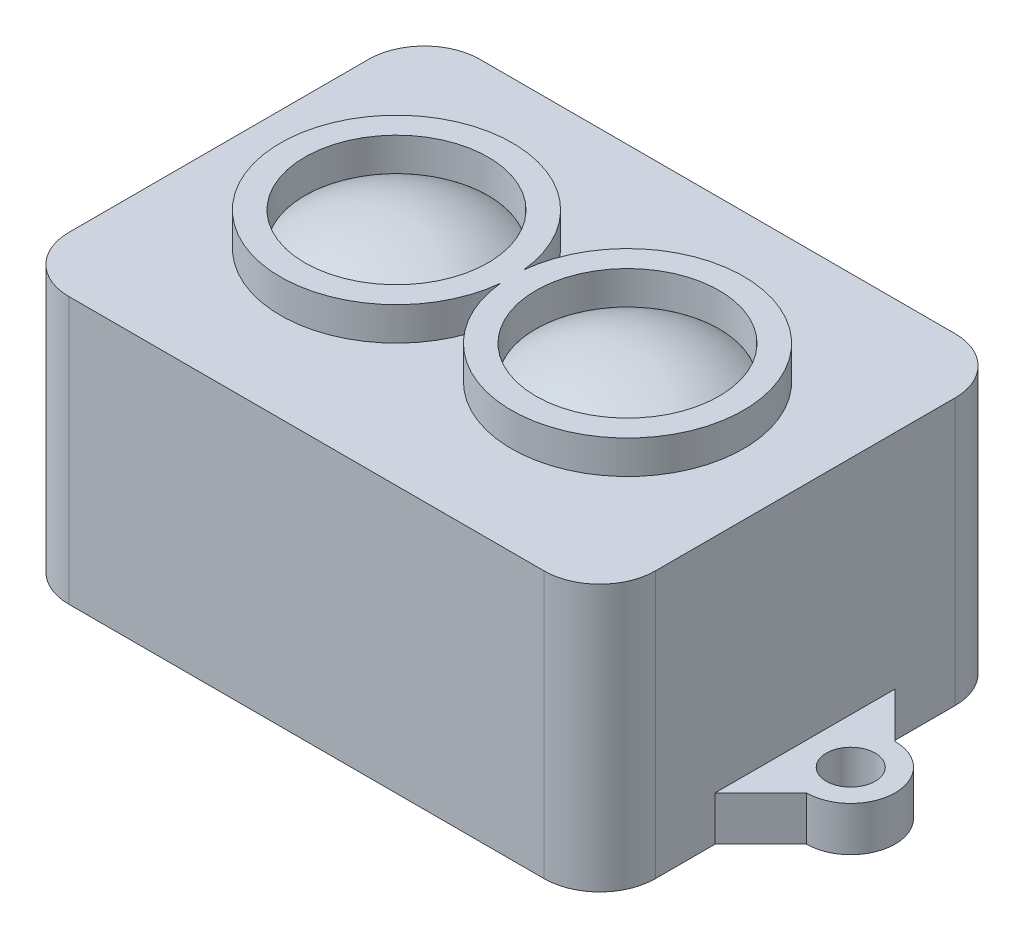
ISO-10303-21;
HEADER;
FILE_DESCRIPTION(('STEP AP214'),'2;1');
FILE_NAME('part.step','',(''),(''),'','','');
FILE_SCHEMA(('AUTOMOTIVE_DESIGN { 1 0 10303 214 1 1 1 1 }'));
ENDSEC;
DATA;
#1=APPLICATION_CONTEXT('core data for automotive mechanical design processes');
#2=APPLICATION_PROTOCOL_DEFINITION('international standard','automotive_design',2000,#1);
#3=PRODUCT_CONTEXT('',#1,'mechanical');
#4=PRODUCT('Part','Part','',(#3));
#5=PRODUCT_RELATED_PRODUCT_CATEGORY('part','',(#4));
#6=PRODUCT_DEFINITION_FORMATION('','',#4);
#7=PRODUCT_DEFINITION_CONTEXT('part definition',#1,'design');
#8=PRODUCT_DEFINITION('design','',#6,#7);
#9=PRODUCT_DEFINITION_SHAPE('','',#8);
#10=(LENGTH_UNIT() NAMED_UNIT(*) SI_UNIT(.MILLI.,.METRE.));
#11=(NAMED_UNIT(*) PLANE_ANGLE_UNIT() SI_UNIT($,.RADIAN.));
#12=(NAMED_UNIT(*) SI_UNIT($,.STERADIAN.) SOLID_ANGLE_UNIT());
#13=UNCERTAINTY_MEASURE_WITH_UNIT(LENGTH_MEASURE(1.E-05),#10,'distance_accuracy_value','');
#14=(GEOMETRIC_REPRESENTATION_CONTEXT(3) GLOBAL_UNCERTAINTY_ASSIGNED_CONTEXT((#13)) GLOBAL_UNIT_ASSIGNED_CONTEXT((#10,
#11,#12)) REPRESENTATION_CONTEXT('',''));
#15=CARTESIAN_POINT('',(0.,0.,0.));
#16=DIRECTION('',(0.,0.,1.));
#17=DIRECTION('',(1.,0.,0.));
#18=AXIS2_PLACEMENT_3D('',#15,#16,#17);
#19=CARTESIAN_POINT('',(5.2,6.10552884615385,0.));
#20=DIRECTION('',(0.,-1.,0.));
#21=DIRECTION('',(1.,0.,0.));
#22=AXIS2_PLACEMENT_3D('',#19,#20,#21);
#23=SPHERICAL_SURFACE('',#22,7.19447115384615);
#24=CARTESIAN_POINT('',(5.2,12.,0.));
#25=DIRECTION('',(0.,1.,0.));
#26=DIRECTION('',(0.,0.,-1.));
#27=AXIS2_PLACEMENT_3D('',#24,#25,#26);
#28=CIRCLE('',#27,4.125);
#29=CARTESIAN_POINT('',(5.2,12.,-4.125));
#30=VERTEX_POINT('',#29);
#31=EDGE_CURVE('E11',#30,#30,#28,.T.);
#32=ORIENTED_EDGE('',*,*,#31,.T.);
#33=EDGE_LOOP('',(#32));
#34=FACE_BOUND('',#33,.T.);
#35=ADVANCED_FACE('F48',(#34),#23,.T.);
#36=CARTESIAN_POINT('',(9.325,12.,0.));
#37=DIRECTION('',(0.,1.,0.));
#38=DIRECTION('',(0.,0.,1.));
#39=AXIS2_PLACEMENT_3D('',#36,#37,#38);
#40=PLANE('',#39);
#41=ORIENTED_EDGE('',*,*,#31,.F.);
#42=EDGE_LOOP('',(#41));
#43=FACE_BOUND('',#42,.T.);
#44=ADVANCED_FACE('F56',(#43),#40,.F.);
#45=CLOSED_SHELL('',(#35,#44));
#46=MANIFOLD_SOLID_BREP('B2',#45);
#47=CARTESIAN_POINT('',(-5.2,6.10552884615385,0.));
#48=DIRECTION('',(0.,-1.,0.));
#49=DIRECTION('',(-1.,0.,0.));
#50=AXIS2_PLACEMENT_3D('',#47,#48,#49);
#51=SPHERICAL_SURFACE('',#50,7.19447115384615);
#52=CARTESIAN_POINT('',(-5.2,12.,0.));
#53=DIRECTION('',(0.,-1.,0.));
#54=DIRECTION('',(0.,0.,-1.));
#55=AXIS2_PLACEMENT_3D('',#52,#53,#54);
#56=CIRCLE('',#55,4.125);
#57=CARTESIAN_POINT('',(-5.2,12.,-4.125));
#58=VERTEX_POINT('',#57);
#59=EDGE_CURVE('E47',#58,#58,#56,.T.);
#60=ORIENTED_EDGE('',*,*,#59,.F.);
#61=EDGE_LOOP('',(#60));
#62=FACE_BOUND('',#61,.T.);
#63=ADVANCED_FACE('F87',(#62),#51,.T.);
#64=CARTESIAN_POINT('',(-9.325,12.,0.));
#65=DIRECTION('',(0.,1.,0.));
#66=DIRECTION('',(0.,0.,1.));
#67=AXIS2_PLACEMENT_3D('',#64,#65,#66);
#68=PLANE('',#67);
#69=ORIENTED_EDGE('',*,*,#59,.T.);
#70=EDGE_LOOP('',(#69));
#71=FACE_BOUND('',#70,.T.);
#72=ADVANCED_FACE('F94',(#71),#68,.F.);
#73=CLOSED_SHELL('',(#63,#72));
#74=MANIFOLD_SOLID_BREP('B6',#73);
#75=CARTESIAN_POINT('',(-10.7,2.,-6.75));
#76=DIRECTION('',(0.,-1.,0.));
#77=DIRECTION('',(0.,0.,-1.));
#78=AXIS2_PLACEMENT_3D('',#75,#76,#77);
#79=CYLINDRICAL_SURFACE('',#78,1.2);
#80=DIRECTION('',(0.,-1.,0.));
#81=VECTOR('',#80,1.);
#82=CARTESIAN_POINT('',(-10.7,2.,-7.95));
#83=LINE('',#82,#81);
#84=CARTESIAN_POINT('',(-10.7,10.,-7.95));
#85=VERTEX_POINT('',#84);
#86=CARTESIAN_POINT('',(-10.7,0.,-7.95));
#87=VERTEX_POINT('',#86);
#88=EDGE_CURVE('E409',#85,#87,#83,.T.);
#89=ORIENTED_EDGE('',*,*,#88,.F.);
#90=CARTESIAN_POINT('',(-10.7,10.,-6.75));
#91=DIRECTION('',(0.,1.,0.));
#92=DIRECTION('',(0.,0.,1.));
#93=AXIS2_PLACEMENT_3D('',#90,#91,#92);
#94=CIRCLE('',#93,1.2);
#95=CARTESIAN_POINT('',(-11.9,10.,-6.74999999999998));
#96=VERTEX_POINT('',#95);
#97=EDGE_CURVE('E136',#85,#96,#94,.T.);
#98=ORIENTED_EDGE('',*,*,#97,.T.);
#99=DIRECTION('',(0.,-1.,0.));
#100=VECTOR('',#99,1.);
#101=CARTESIAN_POINT('',(-11.9,2.,-6.74999999999998));
#102=LINE('',#101,#100);
#103=CARTESIAN_POINT('',(-11.9,0.,-6.74999999999998));
#104=VERTEX_POINT('',#103);
#105=EDGE_CURVE('E430',#96,#104,#102,.T.);
#106=ORIENTED_EDGE('',*,*,#105,.T.);
#107=CARTESIAN_POINT('',(-10.7,0.,-6.75));
#108=DIRECTION('',(0.,1.,0.));
#109=DIRECTION('',(0.,0.,-1.));
#110=AXIS2_PLACEMENT_3D('',#107,#108,#109);
#111=CIRCLE('',#110,1.2);
#112=EDGE_CURVE('E369',#87,#104,#111,.T.);
#113=ORIENTED_EDGE('',*,*,#112,.F.);
#114=EDGE_LOOP('',(#89,#98,#106,#113));
#115=FACE_BOUND('',#114,.T.);
#116=ADVANCED_FACE('F113',(#115),#79,.F.);
#117=CARTESIAN_POINT('',(-11.9,2.,6.74999999999999));
#118=DIRECTION('',(1.,0.,0.));
#119=DIRECTION('',(0.,0.,-1.));
#120=AXIS2_PLACEMENT_3D('',#117,#118,#119);
#121=PLANE('',#120);
#122=ORIENTED_EDGE('',*,*,#105,.F.);
#123=DIRECTION('',(0.,0.,1.));
#124=VECTOR('',#123,1.);
#125=CARTESIAN_POINT('',(-11.9,10.,6.74999999999999));
#126=LINE('',#125,#124);
#127=CARTESIAN_POINT('',(-11.9,10.,6.74999999999999));
#128=VERTEX_POINT('',#127);
#129=EDGE_CURVE('E331',#96,#128,#126,.T.);
#130=ORIENTED_EDGE('',*,*,#129,.T.);
#131=DIRECTION('',(0.,-1.,0.));
#132=VECTOR('',#131,1.);
#133=CARTESIAN_POINT('',(-11.9,2.,6.74999999999999));
#134=LINE('',#133,#132);
#135=CARTESIAN_POINT('',(-11.9,0.,6.74999999999999));
#136=VERTEX_POINT('',#135);
#137=EDGE_CURVE('E427',#128,#136,#134,.T.);
#138=ORIENTED_EDGE('',*,*,#137,.T.);
#139=DIRECTION('',(0.,0.,1.));
#140=VECTOR('',#139,1.);
#141=CARTESIAN_POINT('',(-11.9,0.,6.74999999999999));
#142=LINE('',#141,#140);
#143=EDGE_CURVE('E381',#104,#136,#142,.T.);
#144=ORIENTED_EDGE('',*,*,#143,.F.);
#145=EDGE_LOOP('',(#122,#130,#138,#144));
#146=FACE_BOUND('',#145,.T.);
#147=ADVANCED_FACE('F674',(#146),#121,.T.);
#148=CARTESIAN_POINT('',(-10.7,2.,6.75));
#149=DIRECTION('',(0.,-1.,0.));
#150=DIRECTION('',(0.,0.,-1.));
#151=AXIS2_PLACEMENT_3D('',#148,#149,#150);
#152=CYLINDRICAL_SURFACE('',#151,1.2);
#153=ORIENTED_EDGE('',*,*,#137,.F.);
#154=CARTESIAN_POINT('',(-10.7,10.,6.75));
#155=DIRECTION('',(0.,1.,0.));
#156=DIRECTION('',(0.,0.,1.));
#157=AXIS2_PLACEMENT_3D('',#154,#155,#156);
#158=CIRCLE('',#157,1.2);
#159=CARTESIAN_POINT('',(-10.7,10.,7.95));
#160=VERTEX_POINT('',#159);
#161=EDGE_CURVE('E327',#128,#160,#158,.T.);
#162=ORIENTED_EDGE('',*,*,#161,.T.);
#163=DIRECTION('',(0.,-1.,0.));
#164=VECTOR('',#163,1.);
#165=CARTESIAN_POINT('',(-10.7,2.,7.95));
#166=LINE('',#165,#164);
#167=CARTESIAN_POINT('',(-10.7,0.,7.95));
#168=VERTEX_POINT('',#167);
#169=EDGE_CURVE('E424',#160,#168,#166,.T.);
#170=ORIENTED_EDGE('',*,*,#169,.T.);
#171=CARTESIAN_POINT('',(-10.7,0.,6.75));
#172=DIRECTION('',(0.,1.,0.));
#173=DIRECTION('',(0.,0.,-1.));
#174=AXIS2_PLACEMENT_3D('',#171,#172,#173);
#175=CIRCLE('',#174,1.2);
#176=EDGE_CURVE('E385',#136,#168,#175,.T.);
#177=ORIENTED_EDGE('',*,*,#176,.F.);
#178=EDGE_LOOP('',(#153,#162,#170,#177));
#179=FACE_BOUND('',#178,.T.);
#180=ADVANCED_FACE('F680',(#179),#152,.F.);
#181=CARTESIAN_POINT('',(-10.7,2.,7.95));
#182=DIRECTION('',(0.,0.,-1.));
#183=DIRECTION('',(-1.,0.,0.));
#184=AXIS2_PLACEMENT_3D('',#181,#182,#183);
#185=PLANE('',#184);
#186=ORIENTED_EDGE('',*,*,#169,.F.);
#187=DIRECTION('',(1.,0.,0.));
#188=VECTOR('',#187,1.);
#189=CARTESIAN_POINT('',(-10.7,10.,7.95));
#190=LINE('',#189,#188);
#191=CARTESIAN_POINT('',(10.7,10.,7.95));
#192=VERTEX_POINT('',#191);
#193=EDGE_CURVE('E323',#160,#192,#190,.T.);
#194=ORIENTED_EDGE('',*,*,#193,.T.);
#195=DIRECTION('',(0.,-1.,0.));
#196=VECTOR('',#195,1.);
#197=CARTESIAN_POINT('',(10.7,2.,7.95));
#198=LINE('',#197,#196);
#199=CARTESIAN_POINT('',(10.7,0.,7.95));
#200=VERTEX_POINT('',#199);
#201=EDGE_CURVE('E421',#192,#200,#198,.T.);
#202=ORIENTED_EDGE('',*,*,#201,.T.);
#203=DIRECTION('',(1.,0.,0.));
#204=VECTOR('',#203,1.);
#205=CARTESIAN_POINT('',(-10.7,0.,7.95));
#206=LINE('',#205,#204);
#207=EDGE_CURVE('E389',#168,#200,#206,.T.);
#208=ORIENTED_EDGE('',*,*,#207,.F.);
#209=EDGE_LOOP('',(#186,#194,#202,#208));
#210=FACE_BOUND('',#209,.T.);
#211=ADVANCED_FACE('F687',(#210),#185,.T.);
#212=CARTESIAN_POINT('',(10.7,2.,6.75));
#213=DIRECTION('',(0.,-1.,0.));
#214=DIRECTION('',(0.,0.,-1.));
#215=AXIS2_PLACEMENT_3D('',#212,#213,#214);
#216=CYLINDRICAL_SURFACE('',#215,1.2);
#217=ORIENTED_EDGE('',*,*,#201,.F.);
#218=CARTESIAN_POINT('',(10.7,10.,6.75));
#219=DIRECTION('',(0.,1.,0.));
#220=DIRECTION('',(0.,0.,1.));
#221=AXIS2_PLACEMENT_3D('',#218,#219,#220);
#222=CIRCLE('',#221,1.2);
#223=CARTESIAN_POINT('',(11.9,10.,6.75));
#224=VERTEX_POINT('',#223);
#225=EDGE_CURVE('E319',#192,#224,#222,.T.);
#226=ORIENTED_EDGE('',*,*,#225,.T.);
#227=DIRECTION('',(0.,-1.,0.));
#228=VECTOR('',#227,1.);
#229=CARTESIAN_POINT('',(11.9,2.,6.74999999999998));
#230=LINE('',#229,#228);
#231=CARTESIAN_POINT('',(11.9,0.,6.74999999999998));
#232=VERTEX_POINT('',#231);
#233=EDGE_CURVE('E418',#224,#232,#230,.T.);
#234=ORIENTED_EDGE('',*,*,#233,.T.);
#235=CARTESIAN_POINT('',(10.7,0.,6.75));
#236=DIRECTION('',(0.,1.,0.));
#237=DIRECTION('',(0.,0.,1.));
#238=AXIS2_PLACEMENT_3D('',#235,#236,#237);
#239=CIRCLE('',#238,1.2);
#240=EDGE_CURVE('E393',#200,#232,#239,.T.);
#241=ORIENTED_EDGE('',*,*,#240,.F.);
#242=EDGE_LOOP('',(#217,#226,#234,#241));
#243=FACE_BOUND('',#242,.T.);
#244=ADVANCED_FACE('F691',(#243),#216,.F.);
#245=CARTESIAN_POINT('',(11.9,2.,6.74999999999998));
#246=DIRECTION('',(-1.,0.,0.));
#247=DIRECTION('',(0.,0.,1.));
#248=AXIS2_PLACEMENT_3D('',#245,#246,#247);
#249=PLANE('',#248);
#250=ORIENTED_EDGE('',*,*,#233,.F.);
#251=DIRECTION('',(0.,0.,-1.));
#252=VECTOR('',#251,1.);
#253=CARTESIAN_POINT('',(11.9,10.,6.74999999999998));
#254=LINE('',#253,#252);
#255=CARTESIAN_POINT('',(11.9,10.,-6.74999999999999));
#256=VERTEX_POINT('',#255);
#257=EDGE_CURVE('E311',#224,#256,#254,.T.);
#258=ORIENTED_EDGE('',*,*,#257,.T.);
#259=DIRECTION('',(0.,-1.,0.));
#260=VECTOR('',#259,1.);
#261=CARTESIAN_POINT('',(11.9,2.,-6.74999999999999));
#262=LINE('',#261,#260);
#263=CARTESIAN_POINT('',(11.9,0.,-6.74999999999999));
#264=VERTEX_POINT('',#263);
#265=EDGE_CURVE('E415',#256,#264,#262,.T.);
#266=ORIENTED_EDGE('',*,*,#265,.T.);
#267=DIRECTION('',(0.,0.,-1.));
#268=VECTOR('',#267,1.);
#269=CARTESIAN_POINT('',(11.9,0.,6.74999999999998));
#270=LINE('',#269,#268);
#271=EDGE_CURVE('E397',#232,#264,#270,.T.);
#272=ORIENTED_EDGE('',*,*,#271,.F.);
#273=EDGE_LOOP('',(#250,#258,#266,#272));
#274=FACE_BOUND('',#273,.T.);
#275=ADVANCED_FACE('F695',(#274),#249,.T.);
#276=CARTESIAN_POINT('',(10.7,2.,-6.75));
#277=DIRECTION('',(0.,-1.,0.));
#278=DIRECTION('',(0.,0.,-1.));
#279=AXIS2_PLACEMENT_3D('',#276,#277,#278);
#280=CYLINDRICAL_SURFACE('',#279,1.2);
#281=ORIENTED_EDGE('',*,*,#265,.F.);
#282=CARTESIAN_POINT('',(10.7,10.,-6.75));
#283=DIRECTION('',(0.,1.,0.));
#284=DIRECTION('',(0.,0.,1.));
#285=AXIS2_PLACEMENT_3D('',#282,#283,#284);
#286=CIRCLE('',#285,1.2);
#287=CARTESIAN_POINT('',(10.7,10.,-7.95));
#288=VERTEX_POINT('',#287);
#289=EDGE_CURVE('E306',#256,#288,#286,.T.);
#290=ORIENTED_EDGE('',*,*,#289,.T.);
#291=DIRECTION('',(0.,-1.,0.));
#292=VECTOR('',#291,1.);
#293=CARTESIAN_POINT('',(10.7,2.,-7.95));
#294=LINE('',#293,#292);
#295=CARTESIAN_POINT('',(10.7,0.,-7.95));
#296=VERTEX_POINT('',#295);
#297=EDGE_CURVE('E412',#288,#296,#294,.T.);
#298=ORIENTED_EDGE('',*,*,#297,.T.);
#299=CARTESIAN_POINT('',(10.7,0.,-6.75));
#300=DIRECTION('',(0.,1.,0.));
#301=DIRECTION('',(0.,0.,-1.));
#302=AXIS2_PLACEMENT_3D('',#299,#300,#301);
#303=CIRCLE('',#302,1.2);
#304=EDGE_CURVE('E401',#264,#296,#303,.T.);
#305=ORIENTED_EDGE('',*,*,#304,.F.);
#306=EDGE_LOOP('',(#281,#290,#298,#305));
#307=FACE_BOUND('',#306,.T.);
#308=ADVANCED_FACE('F699',(#307),#280,.F.);
#309=CARTESIAN_POINT('',(-10.7,2.,-7.95));
#310=DIRECTION('',(0.,0.,1.));
#311=DIRECTION('',(1.,0.,0.));
#312=AXIS2_PLACEMENT_3D('',#309,#310,#311);
#313=PLANE('',#312);
#314=ORIENTED_EDGE('',*,*,#297,.F.);
#315=DIRECTION('',(-1.,0.,0.));
#316=VECTOR('',#315,1.);
#317=CARTESIAN_POINT('',(-10.7,10.,-7.95));
#318=LINE('',#317,#316);
#319=EDGE_CURVE('E85',#288,#85,#318,.T.);
#320=ORIENTED_EDGE('',*,*,#319,.T.);
#321=ORIENTED_EDGE('',*,*,#88,.T.);
#322=DIRECTION('',(-1.,0.,0.));
#323=VECTOR('',#322,1.);
#324=CARTESIAN_POINT('',(-10.7,0.,-7.95));
#325=LINE('',#324,#323);
#326=EDGE_CURVE('E405',#296,#87,#325,.T.);
#327=ORIENTED_EDGE('',*,*,#326,.F.);
#328=EDGE_LOOP('',(#314,#320,#321,#327));
#329=FACE_BOUND('',#328,.T.);
#330=ADVANCED_FACE('F649',(#329),#313,.T.);
#331=CARTESIAN_POINT('',(10.7,2.,6.75));
#332=DIRECTION('',(0.,1.,0.));
#333=DIRECTION('',(0.,0.,1.));
#334=AXIS2_PLACEMENT_3D('',#331,#332,#333);
#335=PLANE('',#334);
#336=DIRECTION('',(0.,0.,-1.));
#337=VECTOR('',#336,1.);
#338=CARTESIAN_POINT('',(13.2,2.,-6.74999999999998));
#339=LINE('',#338,#337);
#340=CARTESIAN_POINT('',(13.2,2.,4.04999999999998));
#341=VERTEX_POINT('',#340);
#342=CARTESIAN_POINT('',(13.2,2.,-4.04999999999999));
#343=VERTEX_POINT('',#342);
#344=EDGE_CURVE('E122',#341,#343,#339,.T.);
#345=ORIENTED_EDGE('',*,*,#344,.F.);
#346=DIRECTION('',(0.707106781186552,0.,-0.707106781186543));
#347=VECTOR('',#346,1.);
#348=CARTESIAN_POINT('',(15.25,2.,2.));
#349=LINE('',#348,#347);
#350=CARTESIAN_POINT('',(15.25,2.,2.));
#351=VERTEX_POINT('',#350);
#352=EDGE_CURVE('E450',#341,#351,#349,.T.);
#353=ORIENTED_EDGE('',*,*,#352,.T.);
#354=CARTESIAN_POINT('',(15.25,2.,0.));
#355=DIRECTION('',(0.,1.,0.));
#356=DIRECTION('',(0.,0.,1.));
#357=AXIS2_PLACEMENT_3D('',#354,#355,#356);
#358=CIRCLE('',#357,2.);
#359=CARTESIAN_POINT('',(15.25,2.,-2.00000000000001));
#360=VERTEX_POINT('',#359);
#361=EDGE_CURVE('E453',#351,#360,#358,.T.);
#362=ORIENTED_EDGE('',*,*,#361,.T.);
#363=DIRECTION('',(-0.707106781186552,0.,-0.707106781186543));
#364=VECTOR('',#363,1.);
#365=CARTESIAN_POINT('',(15.25,2.,-2.00000000000001));
#366=LINE('',#365,#364);
#367=EDGE_CURVE('E457',#360,#343,#366,.T.);
#368=ORIENTED_EDGE('',*,*,#367,.T.);
#369=EDGE_LOOP('',(#345,#353,#362,#368));
#370=FACE_BOUND('',#369,.T.);
#371=CARTESIAN_POINT('',(15.25,2.,0.));
#372=DIRECTION('',(0.,1.,0.));
#373=DIRECTION('',(0.,0.,1.));
#374=AXIS2_PLACEMENT_3D('',#371,#372,#373);
#375=CIRCLE('',#374,1.1);
#376=CARTESIAN_POINT('',(15.25,2.,1.09999999999999));
#377=VERTEX_POINT('',#376);
#378=EDGE_CURVE('E434',#377,#377,#375,.T.);
#379=ORIENTED_EDGE('',*,*,#378,.F.);
#380=EDGE_LOOP('',(#379));
#381=FACE_BOUND('',#380,.T.);
#382=ADVANCED_FACE('F645',(#370,#381),#335,.T.);
#383=DIRECTION('',(0.,0.,1.));
#384=VECTOR('',#383,1.);
#385=CARTESIAN_POINT('',(-13.2,2.,-6.74999999999998));
#386=LINE('',#385,#384);
#387=CARTESIAN_POINT('',(-13.2,2.,-4.05000000000001));
#388=VERTEX_POINT('',#387);
#389=CARTESIAN_POINT('',(-13.2,2.,4.05));
#390=VERTEX_POINT('',#389);
#391=EDGE_CURVE('E370',#388,#390,#386,.T.);
#392=ORIENTED_EDGE('',*,*,#391,.F.);
#393=DIRECTION('',(-0.707106781186546,0.,0.707106781186549));
#394=VECTOR('',#393,1.);
#395=CARTESIAN_POINT('',(-15.25,2.,-2.));
#396=LINE('',#395,#394);
#397=CARTESIAN_POINT('',(-15.25,2.,-2.));
#398=VERTEX_POINT('',#397);
#399=EDGE_CURVE('E460',#388,#398,#396,.T.);
#400=ORIENTED_EDGE('',*,*,#399,.T.);
#401=CARTESIAN_POINT('',(-15.25,2.,0.));
#402=DIRECTION('',(0.,1.,0.));
#403=DIRECTION('',(0.,0.,1.));
#404=AXIS2_PLACEMENT_3D('',#401,#402,#403);
#405=CIRCLE('',#404,2.);
#406=CARTESIAN_POINT('',(-15.25,2.,2.));
#407=VERTEX_POINT('',#406);
#408=EDGE_CURVE('E463',#398,#407,#405,.T.);
#409=ORIENTED_EDGE('',*,*,#408,.T.);
#410=DIRECTION('',(0.707106781186546,0.,0.707106781186548));
#411=VECTOR('',#410,1.);
#412=CARTESIAN_POINT('',(-15.25,2.,2.));
#413=LINE('',#412,#411);
#414=EDGE_CURVE('E466',#407,#390,#413,.T.);
#415=ORIENTED_EDGE('',*,*,#414,.T.);
#416=EDGE_LOOP('',(#392,#400,#409,#415));
#417=FACE_BOUND('',#416,.T.);
#418=CARTESIAN_POINT('',(-15.25,2.,0.));
#419=DIRECTION('',(0.,1.,0.));
#420=DIRECTION('',(0.,0.,1.));
#421=AXIS2_PLACEMENT_3D('',#418,#419,#420);
#422=CIRCLE('',#421,1.1);
#423=CARTESIAN_POINT('',(-15.25,2.,1.1));
#424=VERTEX_POINT('',#423);
#425=EDGE_CURVE('E442',#424,#424,#422,.T.);
#426=ORIENTED_EDGE('',*,*,#425,.F.);
#427=EDGE_LOOP('',(#426));
#428=FACE_BOUND('',#427,.T.);
#429=ADVANCED_FACE('F648',(#417,#428),#335,.T.);
#430=CARTESIAN_POINT('',(10.7,0.,6.75));
#431=DIRECTION('',(0.,1.,0.));
#432=DIRECTION('',(0.,0.,1.));
#433=AXIS2_PLACEMENT_3D('',#430,#431,#432);
#434=PLANE('',#433);
#435=CARTESIAN_POINT('',(15.25,0.,0.));
#436=DIRECTION('',(0.,1.,0.));
#437=DIRECTION('',(0.,0.,1.));
#438=AXIS2_PLACEMENT_3D('',#435,#436,#437);
#439=CIRCLE('',#438,1.1);
#440=CARTESIAN_POINT('',(15.25,0.,1.09999999999999));
#441=VERTEX_POINT('',#440);
#442=EDGE_CURVE('E433',#441,#441,#439,.T.);
#443=ORIENTED_EDGE('',*,*,#442,.T.);
#444=EDGE_LOOP('',(#443));
#445=FACE_BOUND('',#444,.T.);
#446=CARTESIAN_POINT('',(-15.25,0.,0.));
#447=DIRECTION('',(0.,1.,0.));
#448=DIRECTION('',(0.,0.,1.));
#449=AXIS2_PLACEMENT_3D('',#446,#447,#448);
#450=CIRCLE('',#449,1.1);
#451=CARTESIAN_POINT('',(-15.25,0.,1.1));
#452=VERTEX_POINT('',#451);
#453=EDGE_CURVE('E438',#452,#452,#450,.T.);
#454=ORIENTED_EDGE('',*,*,#453,.T.);
#455=EDGE_LOOP('',(#454));
#456=FACE_BOUND('',#455,.T.);
#457=CARTESIAN_POINT('',(10.7,0.,6.75));
#458=DIRECTION('',(0.,1.,0.));
#459=DIRECTION('',(0.,0.,1.));
#460=AXIS2_PLACEMENT_3D('',#457,#458,#459);
#461=CIRCLE('',#460,2.5);
#462=CARTESIAN_POINT('',(10.7,0.,9.25));
#463=VERTEX_POINT('',#462);
#464=CARTESIAN_POINT('',(13.2,0.,6.74999999999998));
#465=VERTEX_POINT('',#464);
#466=EDGE_CURVE('E446',#463,#465,#461,.T.);
#467=ORIENTED_EDGE('',*,*,#466,.F.);
#468=DIRECTION('',(1.,0.,0.));
#469=VECTOR('',#468,1.);
#470=CARTESIAN_POINT('',(-10.7,0.,9.25));
#471=LINE('',#470,#469);
#472=CARTESIAN_POINT('',(-10.7,0.,9.25));
#473=VERTEX_POINT('',#472);
#474=EDGE_CURVE('E454',#473,#463,#471,.T.);
#475=ORIENTED_EDGE('',*,*,#474,.F.);
#476=CARTESIAN_POINT('',(-10.7,0.,6.75));
#477=DIRECTION('',(0.,1.,0.));
#478=DIRECTION('',(0.,0.,-1.));
#479=AXIS2_PLACEMENT_3D('',#476,#477,#478);
#480=CIRCLE('',#479,2.5);
#481=CARTESIAN_POINT('',(-13.2,0.,6.74999999999998));
#482=VERTEX_POINT('',#481);
#483=EDGE_CURVE('E517',#482,#473,#480,.T.);
#484=ORIENTED_EDGE('',*,*,#483,.F.);
#485=DIRECTION('',(0.,0.,1.));
#486=VECTOR('',#485,1.);
#487=CARTESIAN_POINT('',(-13.2,0.,6.74999999999998));
#488=LINE('',#487,#486);
#489=CARTESIAN_POINT('',(-13.2,0.,4.05));
#490=VERTEX_POINT('',#489);
#491=EDGE_CURVE('E513',#490,#482,#488,.T.);
#492=ORIENTED_EDGE('',*,*,#491,.F.);
#493=DIRECTION('',(0.707106781186546,0.,0.707106781186548));
#494=VECTOR('',#493,1.);
#495=CARTESIAN_POINT('',(-15.25,0.,2.));
#496=LINE('',#495,#494);
#497=CARTESIAN_POINT('',(-15.25,0.,2.));
#498=VERTEX_POINT('',#497);
#499=EDGE_CURVE('E510',#498,#490,#496,.T.);
#500=ORIENTED_EDGE('',*,*,#499,.F.);
#501=CARTESIAN_POINT('',(-15.25,0.,0.));
#502=DIRECTION('',(0.,1.,0.));
#503=DIRECTION('',(0.,0.,1.));
#504=AXIS2_PLACEMENT_3D('',#501,#502,#503);
#505=CIRCLE('',#504,2.);
#506=CARTESIAN_POINT('',(-15.25,0.,-2.));
#507=VERTEX_POINT('',#506);
#508=EDGE_CURVE('E507',#507,#498,#505,.T.);
#509=ORIENTED_EDGE('',*,*,#508,.F.);
#510=DIRECTION('',(-0.707106781186546,0.,0.707106781186549));
#511=VECTOR('',#510,1.);
#512=CARTESIAN_POINT('',(-15.25,0.,-2.));
#513=LINE('',#512,#511);
#514=CARTESIAN_POINT('',(-13.2,0.,-4.05000000000001));
#515=VERTEX_POINT('',#514);
#516=EDGE_CURVE('E504',#515,#507,#513,.T.);
#517=ORIENTED_EDGE('',*,*,#516,.F.);
#518=DIRECTION('',(0.,0.,1.));
#519=VECTOR('',#518,1.);
#520=CARTESIAN_POINT('',(-13.2,0.,-4.05000000000001));
#521=LINE('',#520,#519);
#522=CARTESIAN_POINT('',(-13.2,0.,-6.74999999999998));
#523=VERTEX_POINT('',#522);
#524=EDGE_CURVE('E501',#523,#515,#521,.T.);
#525=ORIENTED_EDGE('',*,*,#524,.F.);
#526=CARTESIAN_POINT('',(-10.7,0.,-6.75));
#527=DIRECTION('',(0.,1.,0.));
#528=DIRECTION('',(0.,0.,-1.));
#529=AXIS2_PLACEMENT_3D('',#526,#527,#528);
#530=CIRCLE('',#529,2.5);
#531=CARTESIAN_POINT('',(-10.7,0.,-9.25));
#532=VERTEX_POINT('',#531);
#533=EDGE_CURVE('E497',#532,#523,#530,.T.);
#534=ORIENTED_EDGE('',*,*,#533,.F.);
#535=DIRECTION('',(-1.,0.,0.));
#536=VECTOR('',#535,1.);
#537=CARTESIAN_POINT('',(-10.7,0.,-9.25));
#538=LINE('',#537,#536);
#539=CARTESIAN_POINT('',(10.7,0.,-9.25));
#540=VERTEX_POINT('',#539);
#541=EDGE_CURVE('E493',#540,#532,#538,.T.);
#542=ORIENTED_EDGE('',*,*,#541,.F.);
#543=CARTESIAN_POINT('',(10.7,0.,-6.75));
#544=DIRECTION('',(0.,1.,0.));
#545=DIRECTION('',(0.,0.,-1.));
#546=AXIS2_PLACEMENT_3D('',#543,#544,#545);
#547=CIRCLE('',#546,2.5);
#548=CARTESIAN_POINT('',(13.2,0.,-6.74999999999998));
#549=VERTEX_POINT('',#548);
#550=EDGE_CURVE('E489',#549,#540,#547,.T.);
#551=ORIENTED_EDGE('',*,*,#550,.F.);
#552=DIRECTION('',(0.,0.,-1.));
#553=VECTOR('',#552,1.);
#554=CARTESIAN_POINT('',(13.2,0.,-4.04999999999999));
#555=LINE('',#554,#553);
#556=CARTESIAN_POINT('',(13.2,0.,-4.04999999999999));
#557=VERTEX_POINT('',#556);
#558=EDGE_CURVE('E485',#557,#549,#555,.T.);
#559=ORIENTED_EDGE('',*,*,#558,.F.);
#560=DIRECTION('',(-0.707106781186552,0.,-0.707106781186543));
#561=VECTOR('',#560,1.);
#562=CARTESIAN_POINT('',(15.25,0.,-2.00000000000001));
#563=LINE('',#562,#561);
#564=CARTESIAN_POINT('',(15.25,0.,-2.00000000000001));
#565=VERTEX_POINT('',#564);
#566=EDGE_CURVE('E482',#565,#557,#563,.T.);
#567=ORIENTED_EDGE('',*,*,#566,.F.);
#568=CARTESIAN_POINT('',(15.25,0.,0.));
#569=DIRECTION('',(0.,1.,0.));
#570=DIRECTION('',(0.,0.,1.));
#571=AXIS2_PLACEMENT_3D('',#568,#569,#570);
#572=CIRCLE('',#571,2.);
#573=CARTESIAN_POINT('',(15.25,0.,2.));
#574=VERTEX_POINT('',#573);
#575=EDGE_CURVE('E479',#574,#565,#572,.T.);
#576=ORIENTED_EDGE('',*,*,#575,.F.);
#577=DIRECTION('',(0.707106781186552,0.,-0.707106781186543));
#578=VECTOR('',#577,1.);
#579=CARTESIAN_POINT('',(15.25,0.,2.));
#580=LINE('',#579,#578);
#581=CARTESIAN_POINT('',(13.2,0.,4.04999999999998));
#582=VERTEX_POINT('',#581);
#583=EDGE_CURVE('E476',#582,#574,#580,.T.);
#584=ORIENTED_EDGE('',*,*,#583,.F.);
#585=DIRECTION('',(0.,0.,-1.));
#586=VECTOR('',#585,1.);
#587=CARTESIAN_POINT('',(13.2,0.,6.74999999999998));
#588=LINE('',#587,#586);
#589=EDGE_CURVE('E473',#465,#582,#588,.T.);
#590=ORIENTED_EDGE('',*,*,#589,.F.);
#591=EDGE_LOOP('',(#467,#475,#484,#492,#500,#509,#517,#525,#534,#542,#551,#559,#567,#576,#584,#590));
#592=FACE_BOUND('',#591,.T.);
#593=ORIENTED_EDGE('',*,*,#112,.T.);
#594=ORIENTED_EDGE('',*,*,#143,.T.);
#595=ORIENTED_EDGE('',*,*,#176,.T.);
#596=ORIENTED_EDGE('',*,*,#207,.T.);
#597=ORIENTED_EDGE('',*,*,#240,.T.);
#598=ORIENTED_EDGE('',*,*,#271,.T.);
#599=ORIENTED_EDGE('',*,*,#304,.T.);
#600=ORIENTED_EDGE('',*,*,#326,.T.);
#601=EDGE_LOOP('',(#593,#594,#595,#596,#597,#598,#599,#600));
#602=FACE_BOUND('',#601,.T.);
#603=ADVANCED_FACE('F586',(#445,#456,#592,#602),#434,.F.);
#604=CARTESIAN_POINT('',(10.7,2.,6.75));
#605=DIRECTION('',(0.,-1.,0.));
#606=DIRECTION('',(0.,0.,-1.));
#607=AXIS2_PLACEMENT_3D('',#604,#605,#606);
#608=CYLINDRICAL_SURFACE('',#607,2.5);
#609=DIRECTION('',(0.,-1.,0.));
#610=VECTOR('',#609,1.);
#611=CARTESIAN_POINT('',(10.7,2.,9.25));
#612=LINE('',#611,#610);
#613=CARTESIAN_POINT('',(10.7,12.,9.25));
#614=VERTEX_POINT('',#613);
#615=EDGE_CURVE('E469',#614,#463,#612,.T.);
#616=ORIENTED_EDGE('',*,*,#615,.T.);
#617=ORIENTED_EDGE('',*,*,#466,.T.);
#618=DIRECTION('',(0.,-1.,0.));
#619=VECTOR('',#618,1.);
#620=CARTESIAN_POINT('',(13.2,2.,6.74999999999998));
#621=LINE('',#620,#619);
#622=CARTESIAN_POINT('',(13.2,12.,6.75));
#623=VERTEX_POINT('',#622);
#624=EDGE_CURVE('E374',#623,#465,#621,.T.);
#625=ORIENTED_EDGE('',*,*,#624,.F.);
#626=CARTESIAN_POINT('',(10.7,12.,6.74999999999998));
#627=DIRECTION('',(0.,1.,0.));
#628=DIRECTION('',(0.,0.,1.));
#629=AXIS2_PLACEMENT_3D('',#626,#627,#628);
#630=CIRCLE('',#629,2.50000000000002);
#631=EDGE_CURVE('E353',#614,#623,#630,.T.);
#632=ORIENTED_EDGE('',*,*,#631,.F.);
#633=EDGE_LOOP('',(#616,#617,#625,#632));
#634=FACE_BOUND('',#633,.T.);
#635=ADVANCED_FACE('F115',(#634),#608,.T.);
#636=CARTESIAN_POINT('',(15.25,2.,2.));
#637=DIRECTION('',(-0.707106781186543,0.,-0.707106781186552));
#638=DIRECTION('',(-0.707106781186552,0.,0.707106781186543));
#639=AXIS2_PLACEMENT_3D('',#636,#637,#638);
#640=PLANE('',#639);
#641=ORIENTED_EDGE('',*,*,#583,.T.);
#642=DIRECTION('',(0.,-1.,0.));
#643=VECTOR('',#642,1.);
#644=CARTESIAN_POINT('',(15.25,2.,2.));
#645=LINE('',#644,#643);
#646=EDGE_CURVE('E568',#351,#574,#645,.T.);
#647=ORIENTED_EDGE('',*,*,#646,.F.);
#648=ORIENTED_EDGE('',*,*,#352,.F.);
#649=DIRECTION('',(0.,-1.,0.));
#650=VECTOR('',#649,1.);
#651=CARTESIAN_POINT('',(13.2,2.,4.04999999999998));
#652=LINE('',#651,#650);
#653=EDGE_CURVE('E572',#341,#582,#652,.T.);
#654=ORIENTED_EDGE('',*,*,#653,.T.);
#655=EDGE_LOOP('',(#641,#647,#648,#654));
#656=FACE_BOUND('',#655,.T.);
#657=ADVANCED_FACE('F643',(#656),#640,.F.);
#658=CARTESIAN_POINT('',(15.25,2.,0.));
#659=DIRECTION('',(0.,-1.,0.));
#660=DIRECTION('',(0.,0.,-1.));
#661=AXIS2_PLACEMENT_3D('',#658,#659,#660);
#662=CYLINDRICAL_SURFACE('',#661,2.);
#663=ORIENTED_EDGE('',*,*,#575,.T.);
#664=DIRECTION('',(0.,-1.,0.));
#665=VECTOR('',#664,1.);
#666=CARTESIAN_POINT('',(15.25,2.,-2.00000000000001));
#667=LINE('',#666,#665);
#668=EDGE_CURVE('E564',#360,#565,#667,.T.);
#669=ORIENTED_EDGE('',*,*,#668,.F.);
#670=ORIENTED_EDGE('',*,*,#361,.F.);
#671=ORIENTED_EDGE('',*,*,#646,.T.);
#672=EDGE_LOOP('',(#663,#669,#670,#671));
#673=FACE_BOUND('',#672,.T.);
#674=ADVANCED_FACE('F639',(#673),#662,.T.);
#675=CARTESIAN_POINT('',(15.25,2.,-2.00000000000001));
#676=DIRECTION('',(-0.707106781186543,0.,0.707106781186552));
#677=DIRECTION('',(0.707106781186552,0.,0.707106781186543));
#678=AXIS2_PLACEMENT_3D('',#675,#676,#677);
#679=PLANE('',#678);
#680=ORIENTED_EDGE('',*,*,#566,.T.);
#681=DIRECTION('',(0.,-1.,0.));
#682=VECTOR('',#681,1.);
#683=CARTESIAN_POINT('',(13.2,2.,-4.04999999999999));
#684=LINE('',#683,#682);
#685=EDGE_CURVE('E560',#343,#557,#684,.T.);
#686=ORIENTED_EDGE('',*,*,#685,.F.);
#687=ORIENTED_EDGE('',*,*,#367,.F.);
#688=ORIENTED_EDGE('',*,*,#668,.T.);
#689=EDGE_LOOP('',(#680,#686,#687,#688));
#690=FACE_BOUND('',#689,.T.);
#691=ADVANCED_FACE('F635',(#690),#679,.F.);
#692=CARTESIAN_POINT('',(13.2,2.,-4.04999999999999));
#693=DIRECTION('',(-1.,0.,0.));
#694=DIRECTION('',(0.,0.,1.));
#695=AXIS2_PLACEMENT_3D('',#692,#693,#694);
#696=PLANE('',#695);
#697=ORIENTED_EDGE('',*,*,#624,.T.);
#698=ORIENTED_EDGE('',*,*,#589,.T.);
#699=ORIENTED_EDGE('',*,*,#653,.F.);
#700=ORIENTED_EDGE('',*,*,#344,.T.);
#701=ORIENTED_EDGE('',*,*,#685,.T.);
#702=ORIENTED_EDGE('',*,*,#558,.T.);
#703=DIRECTION('',(0.,-1.,0.));
#704=VECTOR('',#703,1.);
#705=CARTESIAN_POINT('',(13.2,2.,-6.74999999999998));
#706=LINE('',#705,#704);
#707=CARTESIAN_POINT('',(13.2,12.,-6.74999999999998));
#708=VERTEX_POINT('',#707);
#709=EDGE_CURVE('E557',#708,#549,#706,.T.);
#710=ORIENTED_EDGE('',*,*,#709,.F.);
#711=DIRECTION('',(0.,0.,-1.));
#712=VECTOR('',#711,1.);
#713=CARTESIAN_POINT('',(13.2,12.,-6.74999999999998));
#714=LINE('',#713,#712);
#715=EDGE_CURVE('E357',#623,#708,#714,.T.);
#716=ORIENTED_EDGE('',*,*,#715,.F.);
#717=EDGE_LOOP('',(#697,#698,#699,#700,#701,#702,#710,#716));
#718=FACE_BOUND('',#717,.T.);
#719=ADVANCED_FACE('F579',(#718),#696,.F.);
#720=CARTESIAN_POINT('',(10.7,2.,-6.75));
#721=DIRECTION('',(0.,-1.,0.));
#722=DIRECTION('',(0.,0.,-1.));
#723=AXIS2_PLACEMENT_3D('',#720,#721,#722);
#724=CYLINDRICAL_SURFACE('',#723,2.5);
#725=ORIENTED_EDGE('',*,*,#709,.T.);
#726=ORIENTED_EDGE('',*,*,#550,.T.);
#727=DIRECTION('',(0.,-1.,0.));
#728=VECTOR('',#727,1.);
#729=CARTESIAN_POINT('',(10.7,2.,-9.25));
#730=LINE('',#729,#728);
#731=CARTESIAN_POINT('',(10.7,12.,-9.25));
#732=VERTEX_POINT('',#731);
#733=EDGE_CURVE('E554',#732,#540,#730,.T.);
#734=ORIENTED_EDGE('',*,*,#733,.F.);
#735=CARTESIAN_POINT('',(10.7,12.,-6.75));
#736=DIRECTION('',(0.,1.,0.));
#737=DIRECTION('',(0.,0.,-1.));
#738=AXIS2_PLACEMENT_3D('',#735,#736,#737);
#739=CIRCLE('',#738,2.5);
#740=EDGE_CURVE('E361',#708,#732,#739,.T.);
#741=ORIENTED_EDGE('',*,*,#740,.F.);
#742=EDGE_LOOP('',(#725,#726,#734,#741));
#743=FACE_BOUND('',#742,.T.);
#744=ADVANCED_FACE('F629',(#743),#724,.T.);
#745=CARTESIAN_POINT('',(-10.7,2.,-9.25));
#746=DIRECTION('',(0.,0.,1.));
#747=DIRECTION('',(1.,0.,0.));
#748=AXIS2_PLACEMENT_3D('',#745,#746,#747);
#749=PLANE('',#748);
#750=ORIENTED_EDGE('',*,*,#733,.T.);
#751=ORIENTED_EDGE('',*,*,#541,.T.);
#752=DIRECTION('',(0.,-1.,0.));
#753=VECTOR('',#752,1.);
#754=CARTESIAN_POINT('',(-10.7,2.,-9.25));
#755=LINE('',#754,#753);
#756=CARTESIAN_POINT('',(-10.7,12.,-9.25));
#757=VERTEX_POINT('',#756);
#758=EDGE_CURVE('E551',#757,#532,#755,.T.);
#759=ORIENTED_EDGE('',*,*,#758,.F.);
#760=DIRECTION('',(-1.,0.,0.));
#761=VECTOR('',#760,1.);
#762=CARTESIAN_POINT('',(-10.7,12.,-9.25));
#763=LINE('',#762,#761);
#764=EDGE_CURVE('E365',#732,#757,#763,.T.);
#765=ORIENTED_EDGE('',*,*,#764,.F.);
#766=EDGE_LOOP('',(#750,#751,#759,#765));
#767=FACE_BOUND('',#766,.T.);
#768=ADVANCED_FACE('F626',(#767),#749,.F.);
#769=CARTESIAN_POINT('',(-10.7,2.,-6.75));
#770=DIRECTION('',(0.,-1.,0.));
#771=DIRECTION('',(0.,0.,-1.));
#772=AXIS2_PLACEMENT_3D('',#769,#770,#771);
#773=CYLINDRICAL_SURFACE('',#772,2.5);
#774=ORIENTED_EDGE('',*,*,#758,.T.);
#775=ORIENTED_EDGE('',*,*,#533,.T.);
#776=DIRECTION('',(0.,-1.,0.));
#777=VECTOR('',#776,1.);
#778=CARTESIAN_POINT('',(-13.2,2.,-6.74999999999998));
#779=LINE('',#778,#777);
#780=CARTESIAN_POINT('',(-13.2,12.,-6.74999999999998));
#781=VERTEX_POINT('',#780);
#782=EDGE_CURVE('E548',#781,#523,#779,.T.);
#783=ORIENTED_EDGE('',*,*,#782,.F.);
#784=CARTESIAN_POINT('',(-10.7,12.,-6.74999999999999));
#785=DIRECTION('',(0.,1.,0.));
#786=DIRECTION('',(0.,0.,-1.));
#787=AXIS2_PLACEMENT_3D('',#784,#785,#786);
#788=CIRCLE('',#787,2.50000000000001);
#789=EDGE_CURVE('E337',#757,#781,#788,.T.);
#790=ORIENTED_EDGE('',*,*,#789,.F.);
#791=EDGE_LOOP('',(#774,#775,#783,#790));
#792=FACE_BOUND('',#791,.T.);
#793=ADVANCED_FACE('F622',(#792),#773,.T.);
#794=CARTESIAN_POINT('',(-15.25,2.,-2.));
#795=DIRECTION('',(0.707106781186549,0.,0.707106781186546));
#796=DIRECTION('',(0.707106781186546,0.,-0.707106781186549));
#797=AXIS2_PLACEMENT_3D('',#794,#795,#796);
#798=PLANE('',#797);
#799=ORIENTED_EDGE('',*,*,#516,.T.);
#800=DIRECTION('',(0.,-1.,0.));
#801=VECTOR('',#800,1.);
#802=CARTESIAN_POINT('',(-15.25,2.,-2.));
#803=LINE('',#802,#801);
#804=EDGE_CURVE('E540',#398,#507,#803,.T.);
#805=ORIENTED_EDGE('',*,*,#804,.F.);
#806=ORIENTED_EDGE('',*,*,#399,.F.);
#807=DIRECTION('',(0.,-1.,0.));
#808=VECTOR('',#807,1.);
#809=CARTESIAN_POINT('',(-13.2,2.,-4.05000000000001));
#810=LINE('',#809,#808);
#811=EDGE_CURVE('E544',#388,#515,#810,.T.);
#812=ORIENTED_EDGE('',*,*,#811,.T.);
#813=EDGE_LOOP('',(#799,#805,#806,#812));
#814=FACE_BOUND('',#813,.T.);
#815=ADVANCED_FACE('F617',(#814),#798,.F.);
#816=CARTESIAN_POINT('',(-15.25,2.,0.));
#817=DIRECTION('',(0.,-1.,0.));
#818=DIRECTION('',(0.,0.,-1.));
#819=AXIS2_PLACEMENT_3D('',#816,#817,#818);
#820=CYLINDRICAL_SURFACE('',#819,2.);
#821=ORIENTED_EDGE('',*,*,#508,.T.);
#822=DIRECTION('',(0.,-1.,0.));
#823=VECTOR('',#822,1.);
#824=CARTESIAN_POINT('',(-15.25,2.,2.));
#825=LINE('',#824,#823);
#826=EDGE_CURVE('E536',#407,#498,#825,.T.);
#827=ORIENTED_EDGE('',*,*,#826,.F.);
#828=ORIENTED_EDGE('',*,*,#408,.F.);
#829=ORIENTED_EDGE('',*,*,#804,.T.);
#830=EDGE_LOOP('',(#821,#827,#828,#829));
#831=FACE_BOUND('',#830,.T.);
#832=ADVANCED_FACE('F612',(#831),#820,.T.);
#833=CARTESIAN_POINT('',(-15.25,2.,2.));
#834=DIRECTION('',(0.707106781186549,0.,-0.707106781186547));
#835=DIRECTION('',(-0.707106781186546,0.,-0.707106781186549));
#836=AXIS2_PLACEMENT_3D('',#833,#834,#835);
#837=PLANE('',#836);
#838=ORIENTED_EDGE('',*,*,#499,.T.);
#839=DIRECTION('',(0.,-1.,0.));
#840=VECTOR('',#839,1.);
#841=CARTESIAN_POINT('',(-13.2,2.,4.05));
#842=LINE('',#841,#840);
#843=EDGE_CURVE('E532',#390,#490,#842,.T.);
#844=ORIENTED_EDGE('',*,*,#843,.F.);
#845=ORIENTED_EDGE('',*,*,#414,.F.);
#846=ORIENTED_EDGE('',*,*,#826,.T.);
#847=EDGE_LOOP('',(#838,#844,#845,#846));
#848=FACE_BOUND('',#847,.T.);
#849=ADVANCED_FACE('F606',(#848),#837,.F.);
#850=CARTESIAN_POINT('',(-13.2,2.,6.74999999999998));
#851=DIRECTION('',(1.,0.,0.));
#852=DIRECTION('',(0.,0.,-1.));
#853=AXIS2_PLACEMENT_3D('',#850,#851,#852);
#854=PLANE('',#853);
#855=ORIENTED_EDGE('',*,*,#782,.T.);
#856=ORIENTED_EDGE('',*,*,#524,.T.);
#857=ORIENTED_EDGE('',*,*,#811,.F.);
#858=ORIENTED_EDGE('',*,*,#391,.T.);
#859=ORIENTED_EDGE('',*,*,#843,.T.);
#860=ORIENTED_EDGE('',*,*,#491,.T.);
#861=DIRECTION('',(0.,-1.,0.));
#862=VECTOR('',#861,1.);
#863=CARTESIAN_POINT('',(-13.2,2.,6.74999999999998));
#864=LINE('',#863,#862);
#865=CARTESIAN_POINT('',(-13.2,12.,6.74999999999998));
#866=VERTEX_POINT('',#865);
#867=EDGE_CURVE('E529',#866,#482,#864,.T.);
#868=ORIENTED_EDGE('',*,*,#867,.F.);
#869=DIRECTION('',(0.,0.,1.));
#870=VECTOR('',#869,1.);
#871=CARTESIAN_POINT('',(-13.2,12.,-6.74999999999998));
#872=LINE('',#871,#870);
#873=EDGE_CURVE('E341',#781,#866,#872,.T.);
#874=ORIENTED_EDGE('',*,*,#873,.F.);
#875=EDGE_LOOP('',(#855,#856,#857,#858,#859,#860,#868,#874));
#876=FACE_BOUND('',#875,.T.);
#877=ADVANCED_FACE('F601',(#876),#854,.F.);
#878=CARTESIAN_POINT('',(-10.7,2.,6.75));
#879=DIRECTION('',(0.,-1.,0.));
#880=DIRECTION('',(0.,0.,-1.));
#881=AXIS2_PLACEMENT_3D('',#878,#879,#880);
#882=CYLINDRICAL_SURFACE('',#881,2.5);
#883=ORIENTED_EDGE('',*,*,#867,.T.);
#884=ORIENTED_EDGE('',*,*,#483,.T.);
#885=DIRECTION('',(0.,-1.,0.));
#886=VECTOR('',#885,1.);
#887=CARTESIAN_POINT('',(-10.7,2.,9.25));
#888=LINE('',#887,#886);
#889=CARTESIAN_POINT('',(-10.7,12.,9.25));
#890=VERTEX_POINT('',#889);
#891=EDGE_CURVE('E526',#890,#473,#888,.T.);
#892=ORIENTED_EDGE('',*,*,#891,.F.);
#893=CARTESIAN_POINT('',(-10.7,12.,6.75));
#894=DIRECTION('',(0.,1.,0.));
#895=DIRECTION('',(0.,0.,1.));
#896=AXIS2_PLACEMENT_3D('',#893,#894,#895);
#897=CIRCLE('',#896,2.5);
#898=EDGE_CURVE('E345',#866,#890,#897,.T.);
#899=ORIENTED_EDGE('',*,*,#898,.F.);
#900=EDGE_LOOP('',(#883,#884,#892,#899));
#901=FACE_BOUND('',#900,.T.);
#902=ADVANCED_FACE('F597',(#901),#882,.T.);
#903=CARTESIAN_POINT('',(-10.7,2.,9.25));
#904=DIRECTION('',(0.,0.,-1.));
#905=DIRECTION('',(-1.,0.,0.));
#906=AXIS2_PLACEMENT_3D('',#903,#904,#905);
#907=PLANE('',#906);
#908=ORIENTED_EDGE('',*,*,#891,.T.);
#909=ORIENTED_EDGE('',*,*,#474,.T.);
#910=ORIENTED_EDGE('',*,*,#615,.F.);
#911=DIRECTION('',(1.,0.,0.));
#912=VECTOR('',#911,1.);
#913=CARTESIAN_POINT('',(-10.7,12.,9.25));
#914=LINE('',#913,#912);
#915=EDGE_CURVE('E349',#890,#614,#914,.T.);
#916=ORIENTED_EDGE('',*,*,#915,.F.);
#917=EDGE_LOOP('',(#908,#909,#910,#916));
#918=FACE_BOUND('',#917,.T.);
#919=ADVANCED_FACE('F592',(#918),#907,.F.);
#920=CARTESIAN_POINT('',(-15.25,2.,0.));
#921=DIRECTION('',(0.,-1.,0.));
#922=DIRECTION('',(0.,0.,-1.));
#923=AXIS2_PLACEMENT_3D('',#920,#921,#922);
#924=CYLINDRICAL_SURFACE('',#923,1.1);
#925=ORIENTED_EDGE('',*,*,#425,.T.);
#926=EDGE_LOOP('',(#925));
#927=FACE_BOUND('',#926,.T.);
#928=ORIENTED_EDGE('',*,*,#453,.F.);
#929=EDGE_LOOP('',(#928));
#930=FACE_BOUND('',#929,.T.);
#931=ADVANCED_FACE('F657',(#927,#930),#924,.F.);
#932=CARTESIAN_POINT('',(15.25,2.,0.));
#933=DIRECTION('',(0.,-1.,0.));
#934=DIRECTION('',(0.,0.,-1.));
#935=AXIS2_PLACEMENT_3D('',#932,#933,#934);
#936=CYLINDRICAL_SURFACE('',#935,1.1);
#937=ORIENTED_EDGE('',*,*,#378,.T.);
#938=EDGE_LOOP('',(#937));
#939=FACE_BOUND('',#938,.T.);
#940=ORIENTED_EDGE('',*,*,#442,.F.);
#941=EDGE_LOOP('',(#940));
#942=FACE_BOUND('',#941,.T.);
#943=ADVANCED_FACE('F653',(#939,#942),#936,.F.);
#944=CARTESIAN_POINT('',(-10.7,12.,-6.74999999999999));
#945=DIRECTION('',(0.,-1.,0.));
#946=DIRECTION('',(0.,0.,-1.));
#947=AXIS2_PLACEMENT_3D('',#944,#945,#946);
#948=PLANE('',#947);
#949=CARTESIAN_POINT('',(5.2,12.,0.));
#950=DIRECTION('',(0.,1.,0.));
#951=DIRECTION('',(0.,0.,1.));
#952=AXIS2_PLACEMENT_3D('',#949,#950,#951);
#953=CIRCLE('',#952,5.225);
#954=CARTESIAN_POINT('',(0.,12.,0.510514446416561));
#955=VERTEX_POINT('',#954);
#956=CARTESIAN_POINT('',(0.,12.,-0.510514446416562));
#957=VERTEX_POINT('',#956);
#958=EDGE_CURVE('E304',#955,#957,#953,.T.);
#959=ORIENTED_EDGE('',*,*,#958,.F.);
#960=CARTESIAN_POINT('',(-5.2,12.,0.));
#961=DIRECTION('',(0.,1.,0.));
#962=DIRECTION('',(0.,0.,1.));
#963=AXIS2_PLACEMENT_3D('',#960,#961,#962);
#964=CIRCLE('',#963,5.225);
#965=EDGE_CURVE('E128',#957,#955,#964,.T.);
#966=ORIENTED_EDGE('',*,*,#965,.F.);
#967=EDGE_LOOP('',(#959,#966));
#968=FACE_BOUND('',#967,.T.);
#969=ORIENTED_EDGE('',*,*,#789,.T.);
#970=ORIENTED_EDGE('',*,*,#873,.T.);
#971=ORIENTED_EDGE('',*,*,#898,.T.);
#972=ORIENTED_EDGE('',*,*,#915,.T.);
#973=ORIENTED_EDGE('',*,*,#631,.T.);
#974=ORIENTED_EDGE('',*,*,#715,.T.);
#975=ORIENTED_EDGE('',*,*,#740,.T.);
#976=ORIENTED_EDGE('',*,*,#764,.T.);
#977=EDGE_LOOP('',(#969,#970,#971,#972,#973,#974,#975,#976));
#978=FACE_BOUND('',#977,.T.);
#979=ADVANCED_FACE('F656',(#968,#978),#948,.F.);
#980=CARTESIAN_POINT('',(-10.7,10.,-6.74999999999999));
#981=DIRECTION('',(0.,1.,0.));
#982=DIRECTION('',(0.,0.,1.));
#983=AXIS2_PLACEMENT_3D('',#980,#981,#982);
#984=PLANE('',#983);
#985=ORIENTED_EDGE('',*,*,#97,.F.);
#986=ORIENTED_EDGE('',*,*,#319,.F.);
#987=ORIENTED_EDGE('',*,*,#289,.F.);
#988=ORIENTED_EDGE('',*,*,#257,.F.);
#989=ORIENTED_EDGE('',*,*,#225,.F.);
#990=ORIENTED_EDGE('',*,*,#193,.F.);
#991=ORIENTED_EDGE('',*,*,#161,.F.);
#992=ORIENTED_EDGE('',*,*,#129,.F.);
#993=EDGE_LOOP('',(#985,#986,#987,#988,#989,#990,#991,#992));
#994=FACE_BOUND('',#993,.T.);
#995=ADVANCED_FACE('F709',(#994),#984,.F.);
#996=CARTESIAN_POINT('',(0.,13.5,0.));
#997=DIRECTION('',(0.,1.,0.));
#998=DIRECTION('',(0.,0.,1.));
#999=AXIS2_PLACEMENT_3D('',#996,#997,#998);
#1000=PLANE('',#999);
#1001=CARTESIAN_POINT('',(-5.2,13.5,0.));
#1002=DIRECTION('',(0.,1.,0.));
#1003=DIRECTION('',(0.,0.,1.));
#1004=AXIS2_PLACEMENT_3D('',#1001,#1002,#1003);
#1005=CIRCLE('',#1004,4.125);
#1006=CARTESIAN_POINT('',(-5.2,13.5,4.125));
#1007=VERTEX_POINT('',#1006);
#1008=EDGE_CURVE('E746',#1007,#1007,#1005,.T.);
#1009=ORIENTED_EDGE('',*,*,#1008,.F.);
#1010=EDGE_LOOP('',(#1009));
#1011=FACE_BOUND('',#1010,.T.);
#1012=CARTESIAN_POINT('',(5.2,13.5,0.));
#1013=DIRECTION('',(0.,1.,0.));
#1014=DIRECTION('',(0.,0.,1.));
#1015=AXIS2_PLACEMENT_3D('',#1012,#1013,#1014);
#1016=CIRCLE('',#1015,5.225);
#1017=CARTESIAN_POINT('',(0.,13.5,0.510514446416561));
#1018=VERTEX_POINT('',#1017);
#1019=CARTESIAN_POINT('',(0.,13.5,-0.510514446416562));
#1020=VERTEX_POINT('',#1019);
#1021=EDGE_CURVE('E296',#1018,#1020,#1016,.T.);
#1022=ORIENTED_EDGE('',*,*,#1021,.T.);
#1023=CARTESIAN_POINT('',(-5.2,13.5,0.));
#1024=DIRECTION('',(0.,1.,0.));
#1025=DIRECTION('',(0.,0.,1.));
#1026=AXIS2_PLACEMENT_3D('',#1023,#1024,#1025);
#1027=CIRCLE('',#1026,5.225);
#1028=EDGE_CURVE('E285',#1020,#1018,#1027,.T.);
#1029=ORIENTED_EDGE('',*,*,#1028,.T.);
#1030=EDGE_LOOP('',(#1022,#1029));
#1031=FACE_BOUND('',#1030,.T.);
#1032=CARTESIAN_POINT('',(5.2,13.5,0.));
#1033=DIRECTION('',(0.,1.,0.));
#1034=DIRECTION('',(0.,0.,1.));
#1035=AXIS2_PLACEMENT_3D('',#1032,#1033,#1034);
#1036=CIRCLE('',#1035,4.125);
#1037=CARTESIAN_POINT('',(5.2,13.5,4.125));
#1038=VERTEX_POINT('',#1037);
#1039=EDGE_CURVE('E735',#1038,#1038,#1036,.T.);
#1040=ORIENTED_EDGE('',*,*,#1039,.F.);
#1041=EDGE_LOOP('',(#1040));
#1042=FACE_BOUND('',#1041,.T.);
#1043=ADVANCED_FACE('F298',(#1011,#1031,#1042),#1000,.T.);
#1044=CARTESIAN_POINT('',(5.2,13.5,0.));
#1045=DIRECTION('',(0.,-1.,0.));
#1046=DIRECTION('',(0.,0.,-1.));
#1047=AXIS2_PLACEMENT_3D('',#1044,#1045,#1046);
#1048=CYLINDRICAL_SURFACE('',#1047,5.225);
#1049=ORIENTED_EDGE('',*,*,#958,.T.);
#1050=DIRECTION('',(0.,-1.,0.));
#1051=VECTOR('',#1050,1.);
#1052=CARTESIAN_POINT('',(0.,13.5,-0.510514446416562));
#1053=LINE('',#1052,#1051);
#1054=EDGE_CURVE('E289',#1020,#957,#1053,.T.);
#1055=ORIENTED_EDGE('',*,*,#1054,.F.);
#1056=ORIENTED_EDGE('',*,*,#1021,.F.);
#1057=DIRECTION('',(0.,-1.,0.));
#1058=VECTOR('',#1057,1.);
#1059=CARTESIAN_POINT('',(0.,13.5,0.510514446416561));
#1060=LINE('',#1059,#1058);
#1061=EDGE_CURVE('E292',#1018,#955,#1060,.T.);
#1062=ORIENTED_EDGE('',*,*,#1061,.T.);
#1063=EDGE_LOOP('',(#1049,#1055,#1056,#1062));
#1064=FACE_BOUND('',#1063,.T.);
#1065=ADVANCED_FACE('F303',(#1064),#1048,.T.);
#1066=CARTESIAN_POINT('',(-5.2,13.5,0.));
#1067=DIRECTION('',(0.,-1.,0.));
#1068=DIRECTION('',(0.,0.,-1.));
#1069=AXIS2_PLACEMENT_3D('',#1066,#1067,#1068);
#1070=CYLINDRICAL_SURFACE('',#1069,5.225);
#1071=ORIENTED_EDGE('',*,*,#965,.T.);
#1072=ORIENTED_EDGE('',*,*,#1061,.F.);
#1073=ORIENTED_EDGE('',*,*,#1028,.F.);
#1074=ORIENTED_EDGE('',*,*,#1054,.T.);
#1075=EDGE_LOOP('',(#1071,#1072,#1073,#1074));
#1076=FACE_BOUND('',#1075,.T.);
#1077=ADVANCED_FACE('F287',(#1076),#1070,.T.);
#1078=CARTESIAN_POINT('',(-5.2,13.5,0.));
#1079=DIRECTION('',(0.,-1.,0.));
#1080=DIRECTION('',(0.,0.,-1.));
#1081=AXIS2_PLACEMENT_3D('',#1078,#1079,#1080);
#1082=CYLINDRICAL_SURFACE('',#1081,4.125);
#1083=ORIENTED_EDGE('',*,*,#1008,.T.);
#1084=EDGE_LOOP('',(#1083));
#1085=FACE_BOUND('',#1084,.T.);
#1086=CARTESIAN_POINT('',(-5.2,12.,0.));
#1087=DIRECTION('',(0.,1.,0.));
#1088=DIRECTION('',(0.,0.,1.));
#1089=AXIS2_PLACEMENT_3D('',#1086,#1087,#1088);
#1090=CIRCLE('',#1089,4.125);
#1091=CARTESIAN_POINT('',(-5.2,12.,4.125));
#1092=VERTEX_POINT('',#1091);
#1093=EDGE_CURVE('E743',#1092,#1092,#1090,.T.);
#1094=ORIENTED_EDGE('',*,*,#1093,.F.);
#1095=EDGE_LOOP('',(#1094));
#1096=FACE_BOUND('',#1095,.T.);
#1097=ADVANCED_FACE('F718',(#1085,#1096),#1082,.F.);
#1098=CARTESIAN_POINT('',(5.2,13.5,0.));
#1099=DIRECTION('',(0.,-1.,0.));
#1100=DIRECTION('',(0.,0.,-1.));
#1101=AXIS2_PLACEMENT_3D('',#1098,#1099,#1100);
#1102=CYLINDRICAL_SURFACE('',#1101,4.125);
#1103=ORIENTED_EDGE('',*,*,#1039,.T.);
#1104=EDGE_LOOP('',(#1103));
#1105=FACE_BOUND('',#1104,.T.);
#1106=CARTESIAN_POINT('',(5.2,12.,0.));
#1107=DIRECTION('',(0.,1.,0.));
#1108=DIRECTION('',(0.,0.,1.));
#1109=AXIS2_PLACEMENT_3D('',#1106,#1107,#1108);
#1110=CIRCLE('',#1109,4.125);
#1111=CARTESIAN_POINT('',(5.2,12.,4.125));
#1112=VERTEX_POINT('',#1111);
#1113=EDGE_CURVE('E738',#1112,#1112,#1110,.T.);
#1114=ORIENTED_EDGE('',*,*,#1113,.F.);
#1115=EDGE_LOOP('',(#1114));
#1116=FACE_BOUND('',#1115,.T.);
#1117=ADVANCED_FACE('F724',(#1105,#1116),#1102,.F.);
#1118=ORIENTED_EDGE('',*,*,#1093,.T.);
#1119=EDGE_LOOP('',(#1118));
#1120=FACE_BOUND('',#1119,.T.);
#1121=ADVANCED_FACE('F710',(#1120),#948,.F.);
#1122=ORIENTED_EDGE('',*,*,#1113,.T.);
#1123=EDGE_LOOP('',(#1122));
#1124=FACE_BOUND('',#1123,.T.);
#1125=ADVANCED_FACE('F711',(#1124),#948,.F.);
#1126=CLOSED_SHELL('',(#116,#147,#180,#211,#244,#275,#308,#330,#382,#429,#603,#635,#657,#674,
#691,#719,#744,#768,#793,#815,#832,#849,#877,#902,#919,#931,#943,#979,#995,#1043,#1065,#1077,
#1097,#1117,#1121,#1125));
#1127=MANIFOLD_SOLID_BREP('B42',#1126);
#1128=ADVANCED_BREP_SHAPE_REPRESENTATION('',(#18,#46,#74,#1127),#14);
#1129=SHAPE_DEFINITION_REPRESENTATION(#9,#1128);
ENDSEC;
END-ISO-10303-21;
